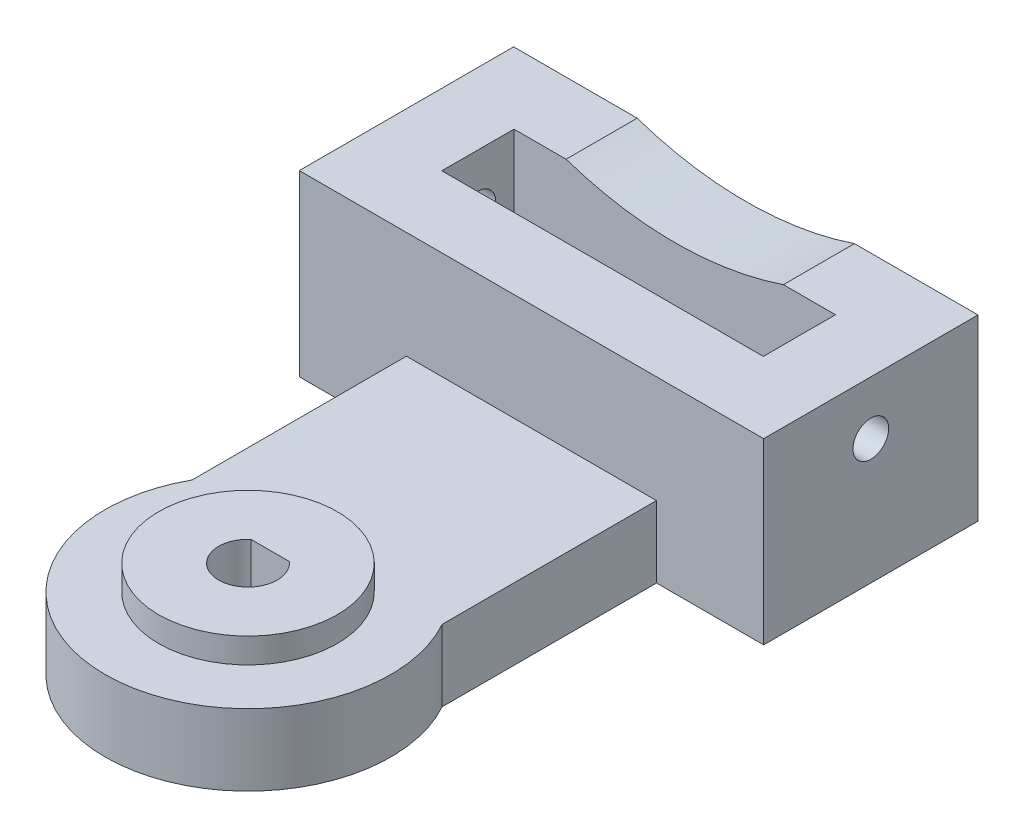
ISO-10303-21;
HEADER;
FILE_DESCRIPTION(('STEP AP214'),'2;1');
FILE_NAME('part.step','',(''),(''),'','','');
FILE_SCHEMA(('AUTOMOTIVE_DESIGN { 1 0 10303 214 1 1 1 1 }'));
ENDSEC;
DATA;
#1=APPLICATION_CONTEXT('core data for automotive mechanical design processes');
#2=APPLICATION_PROTOCOL_DEFINITION('international standard','automotive_design',2000,#1);
#3=PRODUCT_CONTEXT('',#1,'mechanical');
#4=PRODUCT('Part','Part','',(#3));
#5=PRODUCT_RELATED_PRODUCT_CATEGORY('part','',(#4));
#6=PRODUCT_DEFINITION_FORMATION('','',#4);
#7=PRODUCT_DEFINITION_CONTEXT('part definition',#1,'design');
#8=PRODUCT_DEFINITION('design','',#6,#7);
#9=PRODUCT_DEFINITION_SHAPE('','',#8);
#10=(LENGTH_UNIT() NAMED_UNIT(*) SI_UNIT(.MILLI.,.METRE.));
#11=(NAMED_UNIT(*) PLANE_ANGLE_UNIT() SI_UNIT($,.RADIAN.));
#12=(NAMED_UNIT(*) SI_UNIT($,.STERADIAN.) SOLID_ANGLE_UNIT());
#13=UNCERTAINTY_MEASURE_WITH_UNIT(LENGTH_MEASURE(1.E-05),#10,'distance_accuracy_value','');
#14=(GEOMETRIC_REPRESENTATION_CONTEXT(3) GLOBAL_UNCERTAINTY_ASSIGNED_CONTEXT((#13)) GLOBAL_UNIT_ASSIGNED_CONTEXT((#10,
#11,#12)) REPRESENTATION_CONTEXT('',''));
#15=CARTESIAN_POINT('',(0.,0.,0.));
#16=DIRECTION('',(0.,0.,1.));
#17=DIRECTION('',(1.,0.,0.));
#18=AXIS2_PLACEMENT_3D('',#15,#16,#17);
#19=CARTESIAN_POINT('',(0.,10.,0.));
#20=DIRECTION('',(0.,1.,0.));
#21=DIRECTION('',(0.,0.,1.));
#22=AXIS2_PLACEMENT_3D('',#19,#20,#21);
#23=PLANE('',#22);
#24=CARTESIAN_POINT('',(0.,10.,0.));
#25=DIRECTION('',(0.,1.,0.));
#26=DIRECTION('',(0.,0.,1.));
#27=AXIS2_PLACEMENT_3D('',#24,#25,#26);
#28=CIRCLE('',#27,12.5);
#29=CARTESIAN_POINT('',(0.,10.,12.5));
#30=VERTEX_POINT('',#29);
#31=EDGE_CURVE('E242',#30,#30,#28,.T.);
#32=ORIENTED_EDGE('',*,*,#31,.F.);
#33=EDGE_LOOP('',(#32));
#34=FACE_BOUND('',#33,.T.);
#35=DIRECTION('',(0.,0.,-1.));
#36=VECTOR('',#35,1.);
#37=CARTESIAN_POINT('',(17.5,10.,-59.6824583655186));
#38=LINE('',#37,#36);
#39=CARTESIAN_POINT('',(17.5,10.,-9.68245836551855));
#40=VERTEX_POINT('',#39);
#41=CARTESIAN_POINT('',(17.5,10.,-39.6824583655185));
#42=VERTEX_POINT('',#41);
#43=EDGE_CURVE('E252',#40,#42,#38,.T.);
#44=ORIENTED_EDGE('',*,*,#43,.T.);
#45=DIRECTION('',(1.,0.,0.));
#46=VECTOR('',#45,1.);
#47=CARTESIAN_POINT('',(-22.5,10.,-39.6824583655185));
#48=LINE('',#47,#46);
#49=CARTESIAN_POINT('',(-17.5,10.,-39.6824583655185));
#50=VERTEX_POINT('',#49);
#51=EDGE_CURVE('E281',#50,#42,#48,.T.);
#52=ORIENTED_EDGE('',*,*,#51,.F.);
#53=DIRECTION('',(0.,0.,1.));
#54=VECTOR('',#53,1.);
#55=CARTESIAN_POINT('',(-17.5,10.,-59.6824583655185));
#56=LINE('',#55,#54);
#57=CARTESIAN_POINT('',(-17.5,10.,-9.68245836551855));
#58=VERTEX_POINT('',#57);
#59=EDGE_CURVE('E253',#50,#58,#56,.T.);
#60=ORIENTED_EDGE('',*,*,#59,.T.);
#61=CARTESIAN_POINT('',(0.,10.,0.));
#62=DIRECTION('',(0.,1.,0.));
#63=DIRECTION('',(0.,0.,1.));
#64=AXIS2_PLACEMENT_3D('',#61,#62,#63);
#65=CIRCLE('',#64,20.);
#66=EDGE_CURVE('E274',#58,#40,#65,.T.);
#67=ORIENTED_EDGE('',*,*,#66,.T.);
#68=EDGE_LOOP('',(#44,#52,#60,#67));
#69=FACE_BOUND('',#68,.T.);
#70=ADVANCED_FACE('F43',(#34,#69),#23,.T.);
#71=CARTESIAN_POINT('',(0.,16.,0.));
#72=DIRECTION('',(0.,-1.,0.));
#73=DIRECTION('',(0.,0.,-1.));
#74=AXIS2_PLACEMENT_3D('',#71,#72,#73);
#75=CYLINDRICAL_SURFACE('',#74,12.5);
#76=ORIENTED_EDGE('',*,*,#31,.T.);
#77=EDGE_LOOP('',(#76));
#78=FACE_BOUND('',#77,.T.);
#79=CARTESIAN_POINT('',(0.,13.5,0.));
#80=DIRECTION('',(0.,1.,0.));
#81=DIRECTION('',(0.,0.,1.));
#82=AXIS2_PLACEMENT_3D('',#79,#80,#81);
#83=CIRCLE('',#82,12.5);
#84=CARTESIAN_POINT('',(0.,13.5,12.5));
#85=VERTEX_POINT('',#84);
#86=EDGE_CURVE('E177',#85,#85,#83,.T.);
#87=ORIENTED_EDGE('',*,*,#86,.F.);
#88=EDGE_LOOP('',(#87));
#89=FACE_BOUND('',#88,.T.);
#90=ADVANCED_FACE('F343',(#78,#89),#75,.T.);
#91=DIRECTION('',(1.,0.,0.));
#92=VECTOR('',#91,1.);
#93=CARTESIAN_POINT('',(-22.5,10.,-49.6324583655186));
#94=LINE('',#93,#92);
#95=CARTESIAN_POINT('',(-22.5,10.,-49.6324583655186));
#96=VERTEX_POINT('',#95);
#97=CARTESIAN_POINT('',(22.5,10.,-49.6324583655186));
#98=VERTEX_POINT('',#97);
#99=EDGE_CURVE('E292',#96,#98,#94,.T.);
#100=ORIENTED_EDGE('',*,*,#99,.T.);
#101=DIRECTION('',(0.,0.,1.));
#102=VECTOR('',#101,1.);
#103=CARTESIAN_POINT('',(22.5,10.,-69.6824583655186));
#104=LINE('',#103,#102);
#105=CARTESIAN_POINT('',(22.5,10.,-59.7324583655185));
#106=VERTEX_POINT('',#105);
#107=EDGE_CURVE('E230',#106,#98,#104,.T.);
#108=ORIENTED_EDGE('',*,*,#107,.F.);
#109=DIRECTION('',(-1.,0.,0.));
#110=VECTOR('',#109,1.);
#111=CARTESIAN_POINT('',(22.5,10.,-59.7324583655185));
#112=LINE('',#111,#110);
#113=CARTESIAN_POINT('',(-22.5,10.,-59.7324583655185));
#114=VERTEX_POINT('',#113);
#115=EDGE_CURVE('E179',#106,#114,#112,.T.);
#116=ORIENTED_EDGE('',*,*,#115,.T.);
#117=DIRECTION('',(0.,0.,1.));
#118=VECTOR('',#117,1.);
#119=CARTESIAN_POINT('',(-22.5,10.,-69.6824583655185));
#120=LINE('',#119,#118);
#121=EDGE_CURVE('E235',#114,#96,#120,.T.);
#122=ORIENTED_EDGE('',*,*,#121,.T.);
#123=EDGE_LOOP('',(#100,#108,#116,#122));
#124=FACE_BOUND('',#123,.T.);
#125=ADVANCED_FACE('F303',(#124),#23,.T.);
#126=CARTESIAN_POINT('',(0.,10.,0.));
#127=DIRECTION('',(0.,-1.,0.));
#128=DIRECTION('',(0.,0.,-1.));
#129=AXIS2_PLACEMENT_3D('',#126,#127,#128);
#130=CYLINDRICAL_SURFACE('',#129,20.);
#131=DIRECTION('',(0.,-1.,0.));
#132=VECTOR('',#131,1.);
#133=CARTESIAN_POINT('',(-17.5,71.0327780786685,-9.68245836551855));
#134=LINE('',#133,#132);
#135=CARTESIAN_POINT('',(-17.5,0.,-9.68245836551855));
#136=VERTEX_POINT('',#135);
#137=EDGE_CURVE('E251',#58,#136,#134,.T.);
#138=ORIENTED_EDGE('',*,*,#137,.T.);
#139=CARTESIAN_POINT('',(0.,0.,0.));
#140=DIRECTION('',(0.,1.,0.));
#141=DIRECTION('',(0.,0.,1.));
#142=AXIS2_PLACEMENT_3D('',#139,#140,#141);
#143=CIRCLE('',#142,20.);
#144=CARTESIAN_POINT('',(17.5,0.,-9.68245836551855));
#145=VERTEX_POINT('',#144);
#146=EDGE_CURVE('E271',#136,#145,#143,.T.);
#147=ORIENTED_EDGE('',*,*,#146,.T.);
#148=DIRECTION('',(0.,-1.,0.));
#149=VECTOR('',#148,1.);
#150=CARTESIAN_POINT('',(17.5,71.0327780786685,-9.68245836551855));
#151=LINE('',#150,#149);
#152=EDGE_CURVE('E255',#40,#145,#151,.T.);
#153=ORIENTED_EDGE('',*,*,#152,.F.);
#154=ORIENTED_EDGE('',*,*,#66,.F.);
#155=EDGE_LOOP('',(#138,#147,#153,#154));
#156=FACE_BOUND('',#155,.T.);
#157=ADVANCED_FACE('F44',(#156),#130,.T.);
#158=CARTESIAN_POINT('',(0.,0.,0.));
#159=DIRECTION('',(0.,1.,0.));
#160=DIRECTION('',(0.,0.,1.));
#161=AXIS2_PLACEMENT_3D('',#158,#159,#160);
#162=PLANE('',#161);
#163=DIRECTION('',(0.,0.,1.));
#164=VECTOR('',#163,1.);
#165=CARTESIAN_POINT('',(-17.5,0.,-59.6824583655185));
#166=LINE('',#165,#164);
#167=CARTESIAN_POINT('',(-17.5,0.,-39.6824583655185));
#168=VERTEX_POINT('',#167);
#169=EDGE_CURVE('E250',#168,#136,#166,.T.);
#170=ORIENTED_EDGE('',*,*,#169,.F.);
#171=DIRECTION('',(-1.,0.,0.));
#172=VECTOR('',#171,1.);
#173=CARTESIAN_POINT('',(-32.5,0.,-39.6824583655185));
#174=LINE('',#173,#172);
#175=CARTESIAN_POINT('',(-32.5,0.,-39.6824583655185));
#176=VERTEX_POINT('',#175);
#177=EDGE_CURVE('E196',#168,#176,#174,.T.);
#178=ORIENTED_EDGE('',*,*,#177,.T.);
#179=DIRECTION('',(0.,0.,1.));
#180=VECTOR('',#179,1.);
#181=CARTESIAN_POINT('',(-32.5,0.,-69.6824583655185));
#182=LINE('',#181,#180);
#183=CARTESIAN_POINT('',(-32.5,0.,-69.6824583655185));
#184=VERTEX_POINT('',#183);
#185=EDGE_CURVE('E238',#184,#176,#182,.T.);
#186=ORIENTED_EDGE('',*,*,#185,.F.);
#187=DIRECTION('',(-1.,0.,0.));
#188=VECTOR('',#187,1.);
#189=CARTESIAN_POINT('',(-32.5,0.,-69.6824583655185));
#190=LINE('',#189,#188);
#191=CARTESIAN_POINT('',(32.5,0.,-69.6824583655186));
#192=VERTEX_POINT('',#191);
#193=EDGE_CURVE('E211',#192,#184,#190,.T.);
#194=ORIENTED_EDGE('',*,*,#193,.F.);
#195=DIRECTION('',(0.,0.,1.));
#196=VECTOR('',#195,1.);
#197=CARTESIAN_POINT('',(32.5,0.,-69.6824583655186));
#198=LINE('',#197,#196);
#199=CARTESIAN_POINT('',(32.5,0.,-39.6824583655186));
#200=VERTEX_POINT('',#199);
#201=EDGE_CURVE('E225',#192,#200,#198,.T.);
#202=ORIENTED_EDGE('',*,*,#201,.T.);
#203=CARTESIAN_POINT('',(17.5,0.,-39.6824583655186));
#204=VERTEX_POINT('',#203);
#205=EDGE_CURVE('E203',#200,#204,#174,.T.);
#206=ORIENTED_EDGE('',*,*,#205,.T.);
#207=DIRECTION('',(0.,0.,-1.));
#208=VECTOR('',#207,1.);
#209=CARTESIAN_POINT('',(17.5,0.,-59.6824583655186));
#210=LINE('',#209,#208);
#211=EDGE_CURVE('E247',#145,#204,#210,.T.);
#212=ORIENTED_EDGE('',*,*,#211,.F.);
#213=ORIENTED_EDGE('',*,*,#146,.F.);
#214=EDGE_LOOP('',(#170,#178,#186,#194,#202,#206,#212,#213));
#215=FACE_BOUND('',#214,.T.);
#216=ADVANCED_FACE('F335',(#215),#162,.F.);
#217=CARTESIAN_POINT('',(-17.5,71.0327780786685,-59.6824583655185));
#218=DIRECTION('',(1.,0.,0.));
#219=DIRECTION('',(0.,0.,-1.));
#220=AXIS2_PLACEMENT_3D('',#217,#218,#219);
#221=PLANE('',#220);
#222=ORIENTED_EDGE('',*,*,#59,.F.);
#223=DIRECTION('',(0.,-1.,0.));
#224=VECTOR('',#223,1.);
#225=CARTESIAN_POINT('',(-17.5,71.0327780786685,-39.6824583655185));
#226=LINE('',#225,#224);
#227=EDGE_CURVE('E241',#50,#168,#226,.T.);
#228=ORIENTED_EDGE('',*,*,#227,.T.);
#229=ORIENTED_EDGE('',*,*,#169,.T.);
#230=ORIENTED_EDGE('',*,*,#137,.F.);
#231=EDGE_LOOP('',(#222,#228,#229,#230));
#232=FACE_BOUND('',#231,.T.);
#233=ADVANCED_FACE('F334',(#232),#221,.F.);
#234=CARTESIAN_POINT('',(17.5,71.0327780786685,-59.6824583655186));
#235=DIRECTION('',(-1.,0.,0.));
#236=DIRECTION('',(0.,0.,1.));
#237=AXIS2_PLACEMENT_3D('',#234,#235,#236);
#238=PLANE('',#237);
#239=ORIENTED_EDGE('',*,*,#211,.T.);
#240=DIRECTION('',(0.,1.,0.));
#241=VECTOR('',#240,1.);
#242=CARTESIAN_POINT('',(17.5,71.0327780786685,-39.6824583655185));
#243=LINE('',#242,#241);
#244=EDGE_CURVE('E51',#204,#42,#243,.T.);
#245=ORIENTED_EDGE('',*,*,#244,.T.);
#246=ORIENTED_EDGE('',*,*,#43,.F.);
#247=ORIENTED_EDGE('',*,*,#152,.T.);
#248=EDGE_LOOP('',(#239,#245,#246,#247));
#249=FACE_BOUND('',#248,.T.);
#250=ADVANCED_FACE('F278',(#249),#238,.F.);
#251=CARTESIAN_POINT('',(0.,0.,-39.6824583655185));
#252=DIRECTION('',(0.,0.,1.));
#253=DIRECTION('',(1.,0.,0.));
#254=AXIS2_PLACEMENT_3D('',#251,#252,#253);
#255=PLANE('',#254);
#256=ORIENTED_EDGE('',*,*,#227,.F.);
#257=ORIENTED_EDGE('',*,*,#51,.T.);
#258=ORIENTED_EDGE('',*,*,#244,.F.);
#259=ORIENTED_EDGE('',*,*,#205,.F.);
#260=DIRECTION('',(0.,-1.,0.));
#261=VECTOR('',#260,1.);
#262=CARTESIAN_POINT('',(32.5,0.,-39.6824583655186));
#263=LINE('',#262,#261);
#264=CARTESIAN_POINT('',(32.5,25.,-39.6824583655186));
#265=VERTEX_POINT('',#264);
#266=EDGE_CURVE('E209',#265,#200,#263,.T.);
#267=ORIENTED_EDGE('',*,*,#266,.F.);
#268=DIRECTION('',(1.,0.,0.));
#269=VECTOR('',#268,1.);
#270=CARTESIAN_POINT('',(-22.5,25.,-39.6824583655185));
#271=LINE('',#270,#269);
#272=CARTESIAN_POINT('',(-32.5,25.,-39.6824583655185));
#273=VERTEX_POINT('',#272);
#274=EDGE_CURVE('E210',#273,#265,#271,.T.);
#275=ORIENTED_EDGE('',*,*,#274,.F.);
#276=DIRECTION('',(0.,1.,0.));
#277=VECTOR('',#276,1.);
#278=CARTESIAN_POINT('',(-32.5,25.,-39.6824583655185));
#279=LINE('',#278,#277);
#280=EDGE_CURVE('E202',#176,#273,#279,.T.);
#281=ORIENTED_EDGE('',*,*,#280,.F.);
#282=ORIENTED_EDGE('',*,*,#177,.F.);
#283=EDGE_LOOP('',(#256,#257,#258,#259,#267,#275,#281,#282));
#284=FACE_BOUND('',#283,.T.);
#285=ADVANCED_FACE('F286',(#284),#255,.T.);
#286=CARTESIAN_POINT('',(-32.5,25.,-69.6824583655185));
#287=DIRECTION('',(1.,0.,0.));
#288=DIRECTION('',(0.,0.,-1.));
#289=AXIS2_PLACEMENT_3D('',#286,#287,#288);
#290=PLANE('',#289);
#291=CARTESIAN_POINT('',(-32.5,17.5,-54.6824583655185));
#292=DIRECTION('',(-1.,0.,0.));
#293=DIRECTION('',(0.,0.,1.));
#294=AXIS2_PLACEMENT_3D('',#291,#292,#293);
#295=CIRCLE('',#294,2.5);
#296=CARTESIAN_POINT('',(-32.5,17.5,-52.1824583655185));
#297=VERTEX_POINT('',#296);
#298=EDGE_CURVE('E189',#297,#297,#295,.T.);
#299=ORIENTED_EDGE('',*,*,#298,.F.);
#300=EDGE_LOOP('',(#299));
#301=FACE_BOUND('',#300,.T.);
#302=ORIENTED_EDGE('',*,*,#185,.T.);
#303=ORIENTED_EDGE('',*,*,#280,.T.);
#304=DIRECTION('',(0.,0.,1.));
#305=VECTOR('',#304,1.);
#306=CARTESIAN_POINT('',(-32.5,25.,-69.6824583655185));
#307=LINE('',#306,#305);
#308=CARTESIAN_POINT('',(-32.5,25.,-69.6824583655185));
#309=VERTEX_POINT('',#308);
#310=EDGE_CURVE('E236',#309,#273,#307,.T.);
#311=ORIENTED_EDGE('',*,*,#310,.F.);
#312=DIRECTION('',(0.,1.,0.));
#313=VECTOR('',#312,1.);
#314=CARTESIAN_POINT('',(-32.5,25.,-69.6824583655185));
#315=LINE('',#314,#313);
#316=EDGE_CURVE('E212',#184,#309,#315,.T.);
#317=ORIENTED_EDGE('',*,*,#316,.F.);
#318=EDGE_LOOP('',(#302,#303,#311,#317));
#319=FACE_BOUND('',#318,.T.);
#320=ADVANCED_FACE('F321',(#301,#319),#290,.F.);
#321=CARTESIAN_POINT('',(-22.5,25.,-69.6824583655185));
#322=DIRECTION('',(0.,-1.,0.));
#323=DIRECTION('',(0.,0.,-1.));
#324=AXIS2_PLACEMENT_3D('',#321,#322,#323);
#325=PLANE('',#324);
#326=DIRECTION('',(1.,0.,0.));
#327=VECTOR('',#326,1.);
#328=CARTESIAN_POINT('',(22.5,25.,-59.7324583655185));
#329=LINE('',#328,#327);
#330=CARTESIAN_POINT('',(-22.5,25.,-59.7324583655185));
#331=VERTEX_POINT('',#330);
#332=CARTESIAN_POINT('',(-15.2069063257456,25.,-59.7324583655185));
#333=VERTEX_POINT('',#332);
#334=EDGE_CURVE('E176',#331,#333,#329,.T.);
#335=ORIENTED_EDGE('',*,*,#334,.T.);
#336=DIRECTION('',(0.,0.,-1.));
#337=VECTOR('',#336,1.);
#338=CARTESIAN_POINT('',(-15.2069063257456,25.,-59.7324583655185));
#339=LINE('',#338,#337);
#340=CARTESIAN_POINT('',(-15.2069063257456,25.,-69.6824583655185));
#341=VERTEX_POINT('',#340);
#342=EDGE_CURVE('E59',#333,#341,#339,.T.);
#343=ORIENTED_EDGE('',*,*,#342,.T.);
#344=DIRECTION('',(1.,0.,0.));
#345=VECTOR('',#344,1.);
#346=CARTESIAN_POINT('',(-22.5,25.,-69.6824583655185));
#347=LINE('',#346,#345);
#348=EDGE_CURVE('E220',#309,#341,#347,.T.);
#349=ORIENTED_EDGE('',*,*,#348,.F.);
#350=ORIENTED_EDGE('',*,*,#310,.T.);
#351=ORIENTED_EDGE('',*,*,#274,.T.);
#352=DIRECTION('',(0.,0.,1.));
#353=VECTOR('',#352,1.);
#354=CARTESIAN_POINT('',(32.5,25.,-69.6824583655186));
#355=LINE('',#354,#353);
#356=CARTESIAN_POINT('',(32.5,25.,-69.6824583655186));
#357=VERTEX_POINT('',#356);
#358=EDGE_CURVE('E222',#357,#265,#355,.T.);
#359=ORIENTED_EDGE('',*,*,#358,.F.);
#360=CARTESIAN_POINT('',(15.2069063257456,25.,-69.6824583655185));
#361=VERTEX_POINT('',#360);
#362=EDGE_CURVE('E167',#361,#357,#347,.T.);
#363=ORIENTED_EDGE('',*,*,#362,.F.);
#364=DIRECTION('',(0.,0.,-1.));
#365=VECTOR('',#364,1.);
#366=CARTESIAN_POINT('',(15.2069063257456,25.,-59.7324583655185));
#367=LINE('',#366,#365);
#368=CARTESIAN_POINT('',(15.2069063257456,25.,-59.7324583655185));
#369=VERTEX_POINT('',#368);
#370=EDGE_CURVE('E158',#361,#369,#367,.F.);
#371=ORIENTED_EDGE('',*,*,#370,.T.);
#372=CARTESIAN_POINT('',(22.5,25.,-59.7324583655185));
#373=VERTEX_POINT('',#372);
#374=EDGE_CURVE('E170',#369,#373,#329,.T.);
#375=ORIENTED_EDGE('',*,*,#374,.T.);
#376=DIRECTION('',(0.,0.,1.));
#377=VECTOR('',#376,1.);
#378=CARTESIAN_POINT('',(22.5,25.,-69.6824583655186));
#379=LINE('',#378,#377);
#380=CARTESIAN_POINT('',(22.5,25.,-49.6324583655186));
#381=VERTEX_POINT('',#380);
#382=EDGE_CURVE('E227',#373,#381,#379,.T.);
#383=ORIENTED_EDGE('',*,*,#382,.T.);
#384=DIRECTION('',(-1.,0.,0.));
#385=VECTOR('',#384,1.);
#386=CARTESIAN_POINT('',(-22.5,25.,-49.6324583655186));
#387=LINE('',#386,#385);
#388=CARTESIAN_POINT('',(-22.5,25.,-49.6324583655186));
#389=VERTEX_POINT('',#388);
#390=EDGE_CURVE('E300',#381,#389,#387,.T.);
#391=ORIENTED_EDGE('',*,*,#390,.T.);
#392=DIRECTION('',(0.,0.,1.));
#393=VECTOR('',#392,1.);
#394=CARTESIAN_POINT('',(-22.5,25.,-69.6824583655185));
#395=LINE('',#394,#393);
#396=EDGE_CURVE('E67',#331,#389,#395,.T.);
#397=ORIENTED_EDGE('',*,*,#396,.F.);
#398=EDGE_LOOP('',(#335,#343,#349,#350,#351,#359,#363,#371,#375,#383,#391,#397));
#399=FACE_BOUND('',#398,.T.);
#400=ADVANCED_FACE('F164',(#399),#325,.F.);
#401=CARTESIAN_POINT('',(-22.5,10.,-69.6824583655185));
#402=DIRECTION('',(-1.,0.,0.));
#403=DIRECTION('',(0.,-1.,0.));
#404=AXIS2_PLACEMENT_3D('',#401,#402,#403);
#405=PLANE('',#404);
#406=CARTESIAN_POINT('',(-22.5,17.5,-54.6824583655185));
#407=DIRECTION('',(-1.,0.,0.));
#408=DIRECTION('',(0.,-1.,0.));
#409=AXIS2_PLACEMENT_3D('',#406,#407,#408);
#410=CIRCLE('',#409,2.5);
#411=CARTESIAN_POINT('',(-22.5,15.,-54.6824583655185));
#412=VERTEX_POINT('',#411);
#413=EDGE_CURVE('E200',#412,#412,#410,.T.);
#414=ORIENTED_EDGE('',*,*,#413,.T.);
#415=EDGE_LOOP('',(#414));
#416=FACE_BOUND('',#415,.T.);
#417=ORIENTED_EDGE('',*,*,#396,.T.);
#418=DIRECTION('',(0.,-1.,0.));
#419=VECTOR('',#418,1.);
#420=CARTESIAN_POINT('',(-22.5,10.,-49.6324583655186));
#421=LINE('',#420,#419);
#422=EDGE_CURVE('E289',#389,#96,#421,.T.);
#423=ORIENTED_EDGE('',*,*,#422,.T.);
#424=ORIENTED_EDGE('',*,*,#121,.F.);
#425=DIRECTION('',(0.,1.,0.));
#426=VECTOR('',#425,1.);
#427=CARTESIAN_POINT('',(-22.5,10.,-59.7324583655185));
#428=LINE('',#427,#426);
#429=EDGE_CURVE('E180',#114,#331,#428,.T.);
#430=ORIENTED_EDGE('',*,*,#429,.T.);
#431=EDGE_LOOP('',(#417,#423,#424,#430));
#432=FACE_BOUND('',#431,.T.);
#433=ADVANCED_FACE('F304',(#416,#432),#405,.F.);
#434=CARTESIAN_POINT('',(22.5,25.,-69.6824583655186));
#435=DIRECTION('',(1.,0.,0.));
#436=DIRECTION('',(0.,1.,0.));
#437=AXIS2_PLACEMENT_3D('',#434,#435,#436);
#438=PLANE('',#437);
#439=CARTESIAN_POINT('',(22.5,17.5,-54.6824583655186));
#440=DIRECTION('',(1.,0.,0.));
#441=DIRECTION('',(0.,1.,0.));
#442=AXIS2_PLACEMENT_3D('',#439,#440,#441);
#443=CIRCLE('',#442,2.5);
#444=CARTESIAN_POINT('',(22.5,20.,-54.6824583655186));
#445=VERTEX_POINT('',#444);
#446=EDGE_CURVE('E191',#445,#445,#443,.T.);
#447=ORIENTED_EDGE('',*,*,#446,.T.);
#448=EDGE_LOOP('',(#447));
#449=FACE_BOUND('',#448,.T.);
#450=ORIENTED_EDGE('',*,*,#107,.T.);
#451=DIRECTION('',(0.,1.,0.));
#452=VECTOR('',#451,1.);
#453=CARTESIAN_POINT('',(22.5,10.,-49.6324583655186));
#454=LINE('',#453,#452);
#455=EDGE_CURVE('E311',#98,#381,#454,.T.);
#456=ORIENTED_EDGE('',*,*,#455,.T.);
#457=ORIENTED_EDGE('',*,*,#382,.F.);
#458=DIRECTION('',(0.,-1.,0.));
#459=VECTOR('',#458,1.);
#460=CARTESIAN_POINT('',(22.5,10.,-59.7324583655185));
#461=LINE('',#460,#459);
#462=EDGE_CURVE('E172',#373,#106,#461,.T.);
#463=ORIENTED_EDGE('',*,*,#462,.T.);
#464=EDGE_LOOP('',(#450,#456,#457,#463));
#465=FACE_BOUND('',#464,.T.);
#466=ADVANCED_FACE('F377',(#449,#465),#438,.F.);
#467=CARTESIAN_POINT('',(32.5,0.,-69.6824583655186));
#468=DIRECTION('',(-1.,0.,0.));
#469=DIRECTION('',(0.,0.,1.));
#470=AXIS2_PLACEMENT_3D('',#467,#468,#469);
#471=PLANE('',#470);
#472=CARTESIAN_POINT('',(32.5,17.5,-54.6824583655186));
#473=DIRECTION('',(-1.,0.,0.));
#474=DIRECTION('',(0.,0.,1.));
#475=AXIS2_PLACEMENT_3D('',#472,#473,#474);
#476=CIRCLE('',#475,2.5);
#477=CARTESIAN_POINT('',(32.5,17.5,-52.1824583655186));
#478=VERTEX_POINT('',#477);
#479=EDGE_CURVE('E186',#478,#478,#476,.T.);
#480=ORIENTED_EDGE('',*,*,#479,.T.);
#481=EDGE_LOOP('',(#480));
#482=FACE_BOUND('',#481,.T.);
#483=ORIENTED_EDGE('',*,*,#358,.T.);
#484=ORIENTED_EDGE('',*,*,#266,.T.);
#485=ORIENTED_EDGE('',*,*,#201,.F.);
#486=DIRECTION('',(0.,-1.,0.));
#487=VECTOR('',#486,1.);
#488=CARTESIAN_POINT('',(32.5,0.,-69.6824583655186));
#489=LINE('',#488,#487);
#490=EDGE_CURVE('E216',#357,#192,#489,.T.);
#491=ORIENTED_EDGE('',*,*,#490,.F.);
#492=EDGE_LOOP('',(#483,#484,#485,#491));
#493=FACE_BOUND('',#492,.T.);
#494=ADVANCED_FACE('F328',(#482,#493),#471,.F.);
#495=CARTESIAN_POINT('',(0.,0.,-69.6824583655185));
#496=DIRECTION('',(0.,0.,1.));
#497=DIRECTION('',(1.,0.,0.));
#498=AXIS2_PLACEMENT_3D('',#495,#496,#497);
#499=PLANE('',#498);
#500=ORIENTED_EDGE('',*,*,#348,.T.);
#501=CARTESIAN_POINT('',(0.,70.,-69.6824583655185));
#502=DIRECTION('',(0.,0.,-1.));
#503=DIRECTION('',(-1.,0.,0.));
#504=AXIS2_PLACEMENT_3D('',#501,#502,#503);
#505=CIRCLE('',#504,47.5);
#506=EDGE_CURVE('E163',#361,#341,#505,.T.);
#507=ORIENTED_EDGE('',*,*,#506,.F.);
#508=ORIENTED_EDGE('',*,*,#362,.T.);
#509=ORIENTED_EDGE('',*,*,#490,.T.);
#510=ORIENTED_EDGE('',*,*,#193,.T.);
#511=ORIENTED_EDGE('',*,*,#316,.T.);
#512=EDGE_LOOP('',(#500,#507,#508,#509,#510,#511));
#513=FACE_BOUND('',#512,.T.);
#514=ADVANCED_FACE('F320',(#513),#499,.F.);
#515=CARTESIAN_POINT('',(32.5,17.5,-54.6824583655186));
#516=DIRECTION('',(-1.,0.,0.));
#517=DIRECTION('',(0.,0.,1.));
#518=AXIS2_PLACEMENT_3D('',#515,#516,#517);
#519=CYLINDRICAL_SURFACE('',#518,2.5);
#520=ORIENTED_EDGE('',*,*,#479,.F.);
#521=EDGE_LOOP('',(#520));
#522=FACE_BOUND('',#521,.T.);
#523=ORIENTED_EDGE('',*,*,#446,.F.);
#524=EDGE_LOOP('',(#523));
#525=FACE_BOUND('',#524,.T.);
#526=ADVANCED_FACE('F390',(#522,#525),#519,.F.);
#527=ORIENTED_EDGE('',*,*,#298,.T.);
#528=EDGE_LOOP('',(#527));
#529=FACE_BOUND('',#528,.T.);
#530=ORIENTED_EDGE('',*,*,#413,.F.);
#531=EDGE_LOOP('',(#530));
#532=FACE_BOUND('',#531,.T.);
#533=ADVANCED_FACE('F392',(#529,#532),#519,.F.);
#534=CARTESIAN_POINT('',(0.,13.5,0.));
#535=DIRECTION('',(0.,1.,0.));
#536=DIRECTION('',(0.,0.,1.));
#537=AXIS2_PLACEMENT_3D('',#534,#535,#536);
#538=PLANE('',#537);
#539=ORIENTED_EDGE('',*,*,#86,.T.);
#540=EDGE_LOOP('',(#539));
#541=FACE_BOUND('',#540,.T.);
#542=DIRECTION('',(1.,0.,0.));
#543=VECTOR('',#542,1.);
#544=CARTESIAN_POINT('',(-2.68328157299975,13.5,-3.1));
#545=LINE('',#544,#543);
#546=CARTESIAN_POINT('',(-2.68328157299975,13.5,-3.1));
#547=VERTEX_POINT('',#546);
#548=CARTESIAN_POINT('',(2.68328157299975,13.5,-3.1));
#549=VERTEX_POINT('',#548);
#550=EDGE_CURVE('E187',#547,#549,#545,.T.);
#551=ORIENTED_EDGE('',*,*,#550,.T.);
#552=CARTESIAN_POINT('',(0.,13.5,0.));
#553=DIRECTION('',(0.,1.,0.));
#554=DIRECTION('',(0.,0.,1.));
#555=AXIS2_PLACEMENT_3D('',#552,#553,#554);
#556=CIRCLE('',#555,4.1);
#557=EDGE_CURVE('E12',#549,#547,#556,.F.);
#558=ORIENTED_EDGE('',*,*,#557,.T.);
#559=EDGE_LOOP('',(#551,#558));
#560=FACE_BOUND('',#559,.T.);
#561=ADVANCED_FACE('F362',(#541,#560),#538,.T.);
#562=CARTESIAN_POINT('',(0.,7.5,0.));
#563=DIRECTION('',(0.,1.,0.));
#564=DIRECTION('',(0.,0.,1.));
#565=AXIS2_PLACEMENT_3D('',#562,#563,#564);
#566=PLANE('',#565);
#567=CARTESIAN_POINT('',(0.,7.5,0.));
#568=DIRECTION('',(0.,1.,0.));
#569=DIRECTION('',(0.,0.,1.));
#570=AXIS2_PLACEMENT_3D('',#567,#568,#569);
#571=CIRCLE('',#570,4.1);
#572=CARTESIAN_POINT('',(2.68328157299975,7.5,-3.1));
#573=VERTEX_POINT('',#572);
#574=CARTESIAN_POINT('',(-2.68328157299975,7.5,-3.1));
#575=VERTEX_POINT('',#574);
#576=EDGE_CURVE('E264',#573,#575,#571,.F.);
#577=ORIENTED_EDGE('',*,*,#576,.F.);
#578=DIRECTION('',(1.,0.,0.));
#579=VECTOR('',#578,1.);
#580=CARTESIAN_POINT('',(-2.68328157299975,7.5,-3.1));
#581=LINE('',#580,#579);
#582=EDGE_CURVE('E268',#575,#573,#581,.T.);
#583=ORIENTED_EDGE('',*,*,#582,.F.);
#584=EDGE_LOOP('',(#577,#583));
#585=FACE_BOUND('',#584,.T.);
#586=ADVANCED_FACE('F359',(#585),#566,.T.);
#587=CARTESIAN_POINT('',(0.,-10.912378292563,0.));
#588=DIRECTION('',(0.,1.,0.));
#589=DIRECTION('',(0.,0.,1.));
#590=AXIS2_PLACEMENT_3D('',#587,#588,#589);
#591=CYLINDRICAL_SURFACE('',#590,4.1);
#592=ORIENTED_EDGE('',*,*,#557,.F.);
#593=DIRECTION('',(0.,1.,0.));
#594=VECTOR('',#593,1.);
#595=CARTESIAN_POINT('',(2.68328157299975,-10.912378292563,-3.1));
#596=LINE('',#595,#594);
#597=EDGE_CURVE('E256',#573,#549,#596,.T.);
#598=ORIENTED_EDGE('',*,*,#597,.F.);
#599=ORIENTED_EDGE('',*,*,#576,.T.);
#600=DIRECTION('',(0.,1.,0.));
#601=VECTOR('',#600,1.);
#602=CARTESIAN_POINT('',(-2.68328157299975,-10.912378292563,-3.1));
#603=LINE('',#602,#601);
#604=EDGE_CURVE('E270',#575,#547,#603,.T.);
#605=ORIENTED_EDGE('',*,*,#604,.T.);
#606=EDGE_LOOP('',(#592,#598,#599,#605));
#607=FACE_BOUND('',#606,.T.);
#608=ADVANCED_FACE('F358',(#607),#591,.F.);
#609=CARTESIAN_POINT('',(-2.68328157299975,-10.912378292563,-3.1));
#610=DIRECTION('',(0.,0.,-1.));
#611=DIRECTION('',(-1.,0.,0.));
#612=AXIS2_PLACEMENT_3D('',#609,#610,#611);
#613=PLANE('',#612);
#614=ORIENTED_EDGE('',*,*,#550,.F.);
#615=ORIENTED_EDGE('',*,*,#604,.F.);
#616=ORIENTED_EDGE('',*,*,#582,.T.);
#617=ORIENTED_EDGE('',*,*,#597,.T.);
#618=EDGE_LOOP('',(#614,#615,#616,#617));
#619=FACE_BOUND('',#618,.T.);
#620=ADVANCED_FACE('F360',(#619),#613,.F.);
#621=CARTESIAN_POINT('',(0.,0.,-59.7324583655185));
#622=DIRECTION('',(0.,0.,1.));
#623=DIRECTION('',(1.,0.,0.));
#624=AXIS2_PLACEMENT_3D('',#621,#622,#623);
#625=PLANE('',#624);
#626=CARTESIAN_POINT('',(0.,70.,-59.7324583655185));
#627=DIRECTION('',(0.,0.,-1.));
#628=DIRECTION('',(-1.,0.,0.));
#629=AXIS2_PLACEMENT_3D('',#626,#627,#628);
#630=CIRCLE('',#629,47.5);
#631=EDGE_CURVE('E153',#369,#333,#630,.T.);
#632=ORIENTED_EDGE('',*,*,#631,.T.);
#633=ORIENTED_EDGE('',*,*,#334,.F.);
#634=ORIENTED_EDGE('',*,*,#429,.F.);
#635=ORIENTED_EDGE('',*,*,#115,.F.);
#636=ORIENTED_EDGE('',*,*,#462,.F.);
#637=ORIENTED_EDGE('',*,*,#374,.F.);
#638=EDGE_LOOP('',(#632,#633,#634,#635,#636,#637));
#639=FACE_BOUND('',#638,.T.);
#640=ADVANCED_FACE('F175',(#639),#625,.T.);
#641=CARTESIAN_POINT('',(0.,0.,-49.6324583655186));
#642=DIRECTION('',(0.,0.,-1.));
#643=DIRECTION('',(-1.,0.,0.));
#644=AXIS2_PLACEMENT_3D('',#641,#642,#643);
#645=PLANE('',#644);
#646=ORIENTED_EDGE('',*,*,#422,.F.);
#647=ORIENTED_EDGE('',*,*,#390,.F.);
#648=ORIENTED_EDGE('',*,*,#455,.F.);
#649=ORIENTED_EDGE('',*,*,#99,.F.);
#650=EDGE_LOOP('',(#646,#647,#648,#649));
#651=FACE_BOUND('',#650,.T.);
#652=ADVANCED_FACE('F307',(#651),#645,.T.);
#653=CARTESIAN_POINT('',(0.,70.,-59.7324583655185));
#654=DIRECTION('',(0.,0.,-1.));
#655=DIRECTION('',(-1.,0.,0.));
#656=AXIS2_PLACEMENT_3D('',#653,#654,#655);
#657=CYLINDRICAL_SURFACE('',#656,47.5);
#658=ORIENTED_EDGE('',*,*,#631,.F.);
#659=ORIENTED_EDGE('',*,*,#370,.F.);
#660=ORIENTED_EDGE('',*,*,#506,.T.);
#661=ORIENTED_EDGE('',*,*,#342,.F.);
#662=EDGE_LOOP('',(#658,#659,#660,#661));
#663=FACE_BOUND('',#662,.T.);
#664=ADVANCED_FACE('F151',(#663),#657,.F.);
#665=CLOSED_SHELL('',(#70,#90,#125,#157,#216,#233,#250,#285,#320,#400,#433,#466,#494,#514,#526,
#533,#561,#586,#608,#620,#640,#652,#664));
#666=MANIFOLD_SOLID_BREP('B2',#665);
#667=ADVANCED_BREP_SHAPE_REPRESENTATION('',(#18,#666),#14);
#668=SHAPE_DEFINITION_REPRESENTATION(#9,#667);
ENDSEC;
END-ISO-10303-21;
